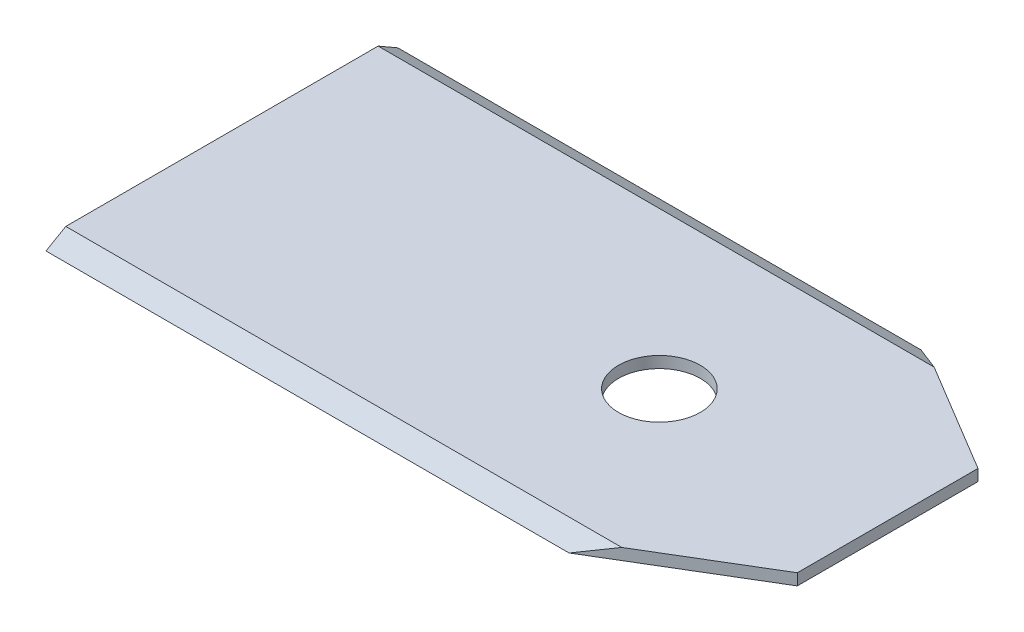
ISO-10303-21;
HEADER;
FILE_DESCRIPTION(('STEP AP214'),'2;1');
FILE_NAME('part.step','',(''),(''),'','','');
FILE_SCHEMA(('AUTOMOTIVE_DESIGN { 1 0 10303 214 1 1 1 1 }'));
ENDSEC;
DATA;
#1=APPLICATION_CONTEXT('core data for automotive mechanical design processes');
#2=APPLICATION_PROTOCOL_DEFINITION('international standard','automotive_design',2000,#1);
#3=PRODUCT_CONTEXT('',#1,'mechanical');
#4=PRODUCT('Part','Part','',(#3));
#5=PRODUCT_RELATED_PRODUCT_CATEGORY('part','',(#4));
#6=PRODUCT_DEFINITION_FORMATION('','',#4);
#7=PRODUCT_DEFINITION_CONTEXT('part definition',#1,'design');
#8=PRODUCT_DEFINITION('design','',#6,#7);
#9=PRODUCT_DEFINITION_SHAPE('','',#8);
#10=(LENGTH_UNIT() NAMED_UNIT(*) SI_UNIT(.MILLI.,.METRE.));
#11=(NAMED_UNIT(*) PLANE_ANGLE_UNIT() SI_UNIT($,.RADIAN.));
#12=(NAMED_UNIT(*) SI_UNIT($,.STERADIAN.) SOLID_ANGLE_UNIT());
#13=UNCERTAINTY_MEASURE_WITH_UNIT(LENGTH_MEASURE(1.E-05),#10,'distance_accuracy_value','');
#14=(GEOMETRIC_REPRESENTATION_CONTEXT(3) GLOBAL_UNCERTAINTY_ASSIGNED_CONTEXT((#13)) GLOBAL_UNIT_ASSIGNED_CONTEXT((#10,
#11,#12)) REPRESENTATION_CONTEXT('',''));
#15=CARTESIAN_POINT('',(0.,0.,0.));
#16=DIRECTION('',(0.,0.,1.));
#17=DIRECTION('',(1.,0.,0.));
#18=AXIS2_PLACEMENT_3D('',#15,#16,#17);
#19=CARTESIAN_POINT('',(0.,0.6,9.25));
#20=DIRECTION('',(1.,0.,0.));
#21=DIRECTION('',(0.,0.,-1.));
#22=AXIS2_PLACEMENT_3D('',#19,#20,#21);
#23=PLANE('',#22);
#24=DIRECTION('',(0.,0.,1.));
#25=VECTOR('',#24,1.);
#26=CARTESIAN_POINT('',(0.,0.,9.25));
#27=LINE('',#26,#25);
#28=CARTESIAN_POINT('',(0.,0.,-9.25));
#29=VERTEX_POINT('',#28);
#30=CARTESIAN_POINT('',(0.,0.,9.25));
#31=VERTEX_POINT('',#30);
#32=EDGE_CURVE('E123',#29,#31,#27,.T.);
#33=ORIENTED_EDGE('',*,*,#32,.T.);
#34=DIRECTION('',(0.,0.5,-0.866025403784439));
#35=VECTOR('',#34,1.);
#36=CARTESIAN_POINT('',(0.,0.6,8.21076951545867));
#37=LINE('',#36,#35);
#38=CARTESIAN_POINT('',(0.,0.6,8.21076951545867));
#39=VERTEX_POINT('',#38);
#40=EDGE_CURVE('E47',#31,#39,#37,.T.);
#41=ORIENTED_EDGE('',*,*,#40,.T.);
#42=DIRECTION('',(0.,0.,1.));
#43=VECTOR('',#42,1.);
#44=CARTESIAN_POINT('',(0.,0.6,9.25));
#45=LINE('',#44,#43);
#46=CARTESIAN_POINT('',(0.,0.6,-8.21076951545867));
#47=VERTEX_POINT('',#46);
#48=EDGE_CURVE('E101',#47,#39,#45,.T.);
#49=ORIENTED_EDGE('',*,*,#48,.F.);
#50=DIRECTION('',(0.,-0.5,-0.866025403784439));
#51=VECTOR('',#50,1.);
#52=CARTESIAN_POINT('',(0.,0.6,-8.21076951545867));
#53=LINE('',#52,#51);
#54=EDGE_CURVE('E152',#47,#29,#53,.T.);
#55=ORIENTED_EDGE('',*,*,#54,.T.);
#56=EDGE_LOOP('',(#33,#41,#49,#55));
#57=FACE_BOUND('',#56,.T.);
#58=ADVANCED_FACE('F38',(#57),#23,.F.);
#59=CARTESIAN_POINT('',(27.5,0.6,9.25));
#60=DIRECTION('',(-0.514495755427526,0.,-0.857492925712544));
#61=DIRECTION('',(-0.857492925712544,0.,0.514495755427526));
#62=AXIS2_PLACEMENT_3D('',#59,#60,#61);
#63=PLANE('',#62);
#64=DIRECTION('',(0.857492925712544,0.,-0.514495755427526));
#65=VECTOR('',#64,1.);
#66=CARTESIAN_POINT('',(27.5,0.6,9.25));
#67=LINE('',#66,#65);
#68=CARTESIAN_POINT('',(29.2320508075689,0.6,8.21076951545867));
#69=VERTEX_POINT('',#68);
#70=CARTESIAN_POINT('',(35.,0.6,4.75));
#71=VERTEX_POINT('',#70);
#72=EDGE_CURVE('E91',#69,#71,#67,.T.);
#73=ORIENTED_EDGE('',*,*,#72,.F.);
#74=DIRECTION('',(-0.821994936526787,-0.28474739872575,0.493196961916072));
#75=VECTOR('',#74,1.);
#76=CARTESIAN_POINT('',(9.48066512677909,-6.24208070380326,20.0616009239325));
#77=LINE('',#76,#75);
#78=CARTESIAN_POINT('',(27.5,0.,9.25));
#79=VERTEX_POINT('',#78);
#80=EDGE_CURVE('E60',#69,#79,#77,.T.);
#81=ORIENTED_EDGE('',*,*,#80,.T.);
#82=DIRECTION('',(0.857492925712544,0.,-0.514495755427526));
#83=VECTOR('',#82,1.);
#84=CARTESIAN_POINT('',(27.5,0.,9.25));
#85=LINE('',#84,#83);
#86=CARTESIAN_POINT('',(35.,0.,4.75));
#87=VERTEX_POINT('',#86);
#88=EDGE_CURVE('E107',#79,#87,#85,.T.);
#89=ORIENTED_EDGE('',*,*,#88,.T.);
#90=DIRECTION('',(0.,-1.,0.));
#91=VECTOR('',#90,1.);
#92=CARTESIAN_POINT('',(35.,0.6,4.75));
#93=LINE('',#92,#91);
#94=EDGE_CURVE('E104',#71,#87,#93,.T.);
#95=ORIENTED_EDGE('',*,*,#94,.F.);
#96=EDGE_LOOP('',(#73,#81,#89,#95));
#97=FACE_BOUND('',#96,.T.);
#98=ADVANCED_FACE('F105',(#97),#63,.F.);
#99=CARTESIAN_POINT('',(35.,0.6,4.75));
#100=DIRECTION('',(-1.,0.,0.));
#101=DIRECTION('',(0.,0.,1.));
#102=AXIS2_PLACEMENT_3D('',#99,#100,#101);
#103=PLANE('',#102);
#104=DIRECTION('',(0.,0.,-1.));
#105=VECTOR('',#104,1.);
#106=CARTESIAN_POINT('',(35.,0.,4.75));
#107=LINE('',#106,#105);
#108=CARTESIAN_POINT('',(35.,0.,-4.75));
#109=VERTEX_POINT('',#108);
#110=EDGE_CURVE('E133',#87,#109,#107,.T.);
#111=ORIENTED_EDGE('',*,*,#110,.T.);
#112=DIRECTION('',(0.,-1.,0.));
#113=VECTOR('',#112,1.);
#114=CARTESIAN_POINT('',(35.,0.6,-4.75));
#115=LINE('',#114,#113);
#116=CARTESIAN_POINT('',(35.,0.6,-4.75));
#117=VERTEX_POINT('',#116);
#118=EDGE_CURVE('E112',#117,#109,#115,.T.);
#119=ORIENTED_EDGE('',*,*,#118,.F.);
#120=DIRECTION('',(0.,0.,-1.));
#121=VECTOR('',#120,1.);
#122=CARTESIAN_POINT('',(35.,0.6,4.75));
#123=LINE('',#122,#121);
#124=EDGE_CURVE('E96',#71,#117,#123,.T.);
#125=ORIENTED_EDGE('',*,*,#124,.F.);
#126=ORIENTED_EDGE('',*,*,#94,.T.);
#127=EDGE_LOOP('',(#111,#119,#125,#126));
#128=FACE_BOUND('',#127,.T.);
#129=ADVANCED_FACE('F114',(#128),#103,.F.);
#130=CARTESIAN_POINT('',(27.5,0.6,-9.25));
#131=DIRECTION('',(-0.514495755427526,0.,0.857492925712544));
#132=DIRECTION('',(0.857492925712544,0.,0.514495755427526));
#133=AXIS2_PLACEMENT_3D('',#130,#131,#132);
#134=PLANE('',#133);
#135=DIRECTION('',(-0.857492925712544,0.,-0.514495755427526));
#136=VECTOR('',#135,1.);
#137=CARTESIAN_POINT('',(27.5,0.,-9.25));
#138=LINE('',#137,#136);
#139=CARTESIAN_POINT('',(27.5,0.,-9.25));
#140=VERTEX_POINT('',#139);
#141=EDGE_CURVE('E136',#109,#140,#138,.T.);
#142=ORIENTED_EDGE('',*,*,#141,.T.);
#143=DIRECTION('',(0.821994936526787,0.28474739872575,0.493196961916072));
#144=VECTOR('',#143,1.);
#145=CARTESIAN_POINT('',(9.48066512677909,-6.24208070380326,-20.0616009239325));
#146=LINE('',#145,#144);
#147=CARTESIAN_POINT('',(29.2320508075689,0.6,-8.21076951545867));
#148=VERTEX_POINT('',#147);
#149=EDGE_CURVE('E11',#140,#148,#146,.T.);
#150=ORIENTED_EDGE('',*,*,#149,.T.);
#151=DIRECTION('',(-0.857492925712544,0.,-0.514495755427526));
#152=VECTOR('',#151,1.);
#153=CARTESIAN_POINT('',(27.5,0.6,-9.25));
#154=LINE('',#153,#152);
#155=EDGE_CURVE('E117',#117,#148,#154,.T.);
#156=ORIENTED_EDGE('',*,*,#155,.F.);
#157=ORIENTED_EDGE('',*,*,#118,.T.);
#158=EDGE_LOOP('',(#142,#150,#156,#157));
#159=FACE_BOUND('',#158,.T.);
#160=ADVANCED_FACE('F182',(#159),#134,.F.);
#161=CARTESIAN_POINT('',(0.,0.6,0.));
#162=DIRECTION('',(0.,1.,0.));
#163=DIRECTION('',(0.,0.,1.));
#164=AXIS2_PLACEMENT_3D('',#161,#162,#163);
#165=PLANE('',#164);
#166=CARTESIAN_POINT('',(23.,0.600000000000001,0.));
#167=DIRECTION('',(0.,1.,0.));
#168=DIRECTION('',(0.,0.,1.));
#169=AXIS2_PLACEMENT_3D('',#166,#167,#168);
#170=CIRCLE('',#169,2.14999999999999);
#171=CARTESIAN_POINT('',(23.,0.600000000000001,2.14999999999999));
#172=VERTEX_POINT('',#171);
#173=EDGE_CURVE('E194',#172,#172,#170,.T.);
#174=ORIENTED_EDGE('',*,*,#173,.F.);
#175=EDGE_LOOP('',(#174));
#176=FACE_BOUND('',#175,.T.);
#177=ORIENTED_EDGE('',*,*,#48,.T.);
#178=DIRECTION('',(1.,0.,0.));
#179=VECTOR('',#178,1.);
#180=CARTESIAN_POINT('',(27.5,0.6,8.21076951545867));
#181=LINE('',#180,#179);
#182=EDGE_CURVE('E98',#39,#69,#181,.T.);
#183=ORIENTED_EDGE('',*,*,#182,.T.);
#184=ORIENTED_EDGE('',*,*,#72,.T.);
#185=ORIENTED_EDGE('',*,*,#124,.T.);
#186=ORIENTED_EDGE('',*,*,#155,.T.);
#187=DIRECTION('',(-1.,0.,0.));
#188=VECTOR('',#187,1.);
#189=CARTESIAN_POINT('',(0.,0.6,-8.21076951545867));
#190=LINE('',#189,#188);
#191=EDGE_CURVE('E111',#148,#47,#190,.T.);
#192=ORIENTED_EDGE('',*,*,#191,.T.);
#193=EDGE_LOOP('',(#177,#183,#184,#185,#186,#192));
#194=FACE_BOUND('',#193,.T.);
#195=ADVANCED_FACE('F94',(#176,#194),#165,.T.);
#196=CARTESIAN_POINT('',(0.,0.,0.));
#197=DIRECTION('',(0.,1.,0.));
#198=DIRECTION('',(0.,0.,1.));
#199=AXIS2_PLACEMENT_3D('',#196,#197,#198);
#200=PLANE('',#199);
#201=CARTESIAN_POINT('',(23.,0.,0.));
#202=DIRECTION('',(0.,1.,0.));
#203=DIRECTION('',(0.,0.,1.));
#204=AXIS2_PLACEMENT_3D('',#201,#202,#203);
#205=CIRCLE('',#204,2.15);
#206=CARTESIAN_POINT('',(23.,0.,2.15));
#207=VERTEX_POINT('',#206);
#208=EDGE_CURVE('E128',#207,#207,#205,.T.);
#209=ORIENTED_EDGE('',*,*,#208,.T.);
#210=EDGE_LOOP('',(#209));
#211=FACE_BOUND('',#210,.T.);
#212=ORIENTED_EDGE('',*,*,#32,.F.);
#213=DIRECTION('',(-1.,0.,0.));
#214=VECTOR('',#213,1.);
#215=CARTESIAN_POINT('',(27.5,0.,-9.25));
#216=LINE('',#215,#214);
#217=EDGE_CURVE('E139',#140,#29,#216,.T.);
#218=ORIENTED_EDGE('',*,*,#217,.F.);
#219=ORIENTED_EDGE('',*,*,#141,.F.);
#220=ORIENTED_EDGE('',*,*,#110,.F.);
#221=ORIENTED_EDGE('',*,*,#88,.F.);
#222=DIRECTION('',(1.,0.,0.));
#223=VECTOR('',#222,1.);
#224=CARTESIAN_POINT('',(27.5,0.,9.25));
#225=LINE('',#224,#223);
#226=EDGE_CURVE('E127',#31,#79,#225,.T.);
#227=ORIENTED_EDGE('',*,*,#226,.F.);
#228=EDGE_LOOP('',(#212,#218,#219,#220,#221,#227));
#229=FACE_BOUND('',#228,.T.);
#230=ADVANCED_FACE('F169',(#211,#229),#200,.F.);
#231=CARTESIAN_POINT('',(23.,0.6,0.));
#232=DIRECTION('',(0.,1.,0.));
#233=DIRECTION('',(0.,0.,1.));
#234=AXIS2_PLACEMENT_3D('',#231,#232,#233);
#235=CYLINDRICAL_SURFACE('',#234,2.14999999999999);
#236=ORIENTED_EDGE('',*,*,#208,.F.);
#237=EDGE_LOOP('',(#236));
#238=FACE_BOUND('',#237,.T.);
#239=ORIENTED_EDGE('',*,*,#173,.T.);
#240=EDGE_LOOP('',(#239));
#241=FACE_BOUND('',#240,.T.);
#242=ADVANCED_FACE('F163',(#238,#241),#235,.F.);
#243=CARTESIAN_POINT('',(0.,0.6,8.21076951545867));
#244=DIRECTION('',(0.,0.866025403784439,0.5));
#245=DIRECTION('',(-1.,0.,0.));
#246=AXIS2_PLACEMENT_3D('',#243,#244,#245);
#247=PLANE('',#246);
#248=ORIENTED_EDGE('',*,*,#40,.F.);
#249=ORIENTED_EDGE('',*,*,#226,.T.);
#250=ORIENTED_EDGE('',*,*,#80,.F.);
#251=ORIENTED_EDGE('',*,*,#182,.F.);
#252=EDGE_LOOP('',(#248,#249,#250,#251));
#253=FACE_BOUND('',#252,.T.);
#254=ADVANCED_FACE('F161',(#253),#247,.T.);
#255=CARTESIAN_POINT('',(0.,0.6,-8.21076951545867));
#256=DIRECTION('',(0.,0.866025403784439,-0.5));
#257=DIRECTION('',(1.,0.,0.));
#258=AXIS2_PLACEMENT_3D('',#255,#256,#257);
#259=PLANE('',#258);
#260=ORIENTED_EDGE('',*,*,#149,.F.);
#261=ORIENTED_EDGE('',*,*,#217,.T.);
#262=ORIENTED_EDGE('',*,*,#54,.F.);
#263=ORIENTED_EDGE('',*,*,#191,.F.);
#264=EDGE_LOOP('',(#260,#261,#262,#263));
#265=FACE_BOUND('',#264,.T.);
#266=ADVANCED_FACE('F40',(#265),#259,.T.);
#267=CLOSED_SHELL('',(#58,#98,#129,#160,#195,#230,#242,#254,#266));
#268=MANIFOLD_SOLID_BREP('B2',#267);
#269=ADVANCED_BREP_SHAPE_REPRESENTATION('',(#18,#268),#14);
#270=SHAPE_DEFINITION_REPRESENTATION(#9,#269);
ENDSEC;
END-ISO-10303-21;
